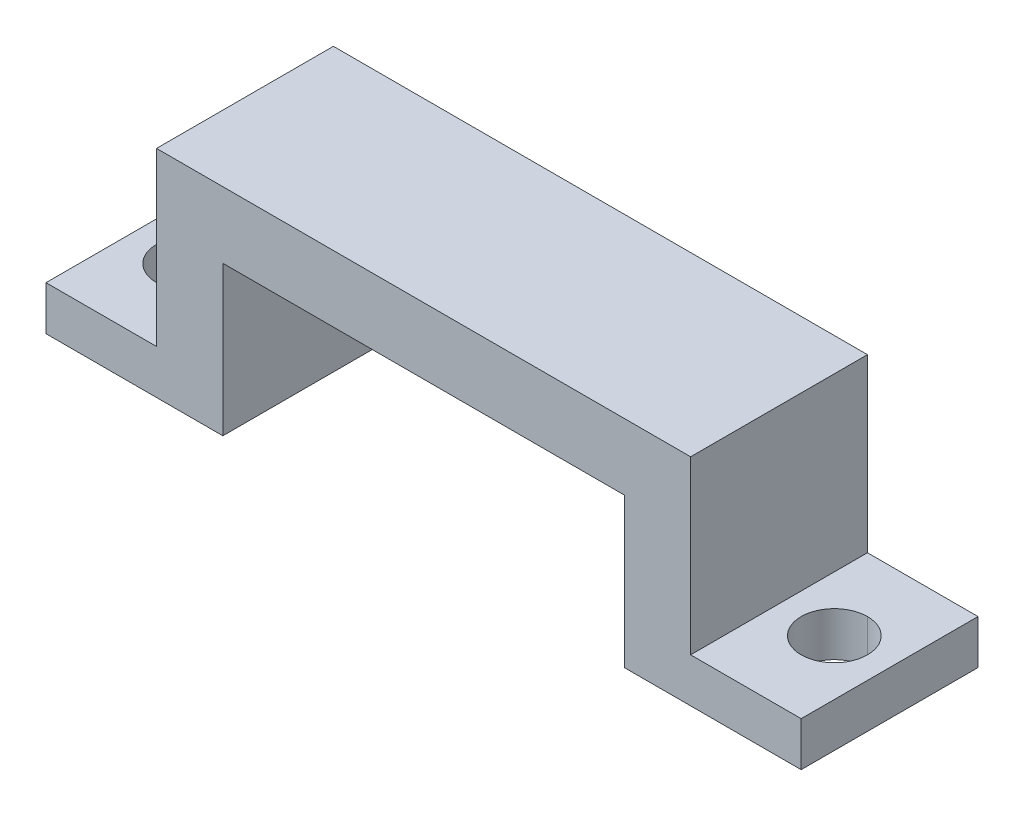
ISO-10303-21;
HEADER;
FILE_DESCRIPTION(('STEP AP214'),'2;1');
FILE_NAME('part.step','',(''),(''),'','','');
FILE_SCHEMA(('AUTOMOTIVE_DESIGN { 1 0 10303 214 1 1 1 1 }'));
ENDSEC;
DATA;
#1=APPLICATION_CONTEXT('core data for automotive mechanical design processes');
#2=APPLICATION_PROTOCOL_DEFINITION('international standard','automotive_design',2000,#1);
#3=PRODUCT_CONTEXT('',#1,'mechanical');
#4=PRODUCT('Part','Part','',(#3));
#5=PRODUCT_RELATED_PRODUCT_CATEGORY('part','',(#4));
#6=PRODUCT_DEFINITION_FORMATION('','',#4);
#7=PRODUCT_DEFINITION_CONTEXT('part definition',#1,'design');
#8=PRODUCT_DEFINITION('design','',#6,#7);
#9=PRODUCT_DEFINITION_SHAPE('','',#8);
#10=(LENGTH_UNIT() NAMED_UNIT(*) SI_UNIT(.MILLI.,.METRE.));
#11=(NAMED_UNIT(*) PLANE_ANGLE_UNIT() SI_UNIT($,.RADIAN.));
#12=(NAMED_UNIT(*) SI_UNIT($,.STERADIAN.) SOLID_ANGLE_UNIT());
#13=UNCERTAINTY_MEASURE_WITH_UNIT(LENGTH_MEASURE(1.E-05),#10,'distance_accuracy_value','');
#14=(GEOMETRIC_REPRESENTATION_CONTEXT(3) GLOBAL_UNCERTAINTY_ASSIGNED_CONTEXT((#13)) GLOBAL_UNIT_ASSIGNED_CONTEXT((#10,
#11,#12)) REPRESENTATION_CONTEXT('',''));
#15=CARTESIAN_POINT('',(0.,0.,0.));
#16=DIRECTION('',(0.,0.,1.));
#17=DIRECTION('',(1.,0.,0.));
#18=AXIS2_PLACEMENT_3D('',#15,#16,#17);
#19=CARTESIAN_POINT('',(14.43,-1.38,4.));
#20=DIRECTION('',(0.,1.,0.));
#21=DIRECTION('',(0.,0.,1.));
#22=AXIS2_PLACEMENT_3D('',#19,#20,#21);
#23=CYLINDRICAL_SURFACE('',#22,1.5);
#24=DIRECTION('',(0.,1.,0.));
#25=VECTOR('',#24,1.);
#26=CARTESIAN_POINT('',(14.43,-1.38,2.5));
#27=LINE('',#26,#25);
#28=CARTESIAN_POINT('',(14.43,-3.38,2.5));
#29=VERTEX_POINT('',#28);
#30=CARTESIAN_POINT('',(14.43,-1.38,2.5));
#31=VERTEX_POINT('',#30);
#32=EDGE_CURVE('E181',#29,#31,#27,.T.);
#33=ORIENTED_EDGE('',*,*,#32,.F.);
#34=CARTESIAN_POINT('',(14.43,-3.38,4.));
#35=DIRECTION('',(0.,1.,0.));
#36=DIRECTION('',(0.,0.,1.));
#37=AXIS2_PLACEMENT_3D('',#34,#35,#36);
#38=CIRCLE('',#37,1.5);
#39=CARTESIAN_POINT('',(14.43,-3.38,5.5));
#40=VERTEX_POINT('',#39);
#41=EDGE_CURVE('E167',#40,#29,#38,.T.);
#42=ORIENTED_EDGE('',*,*,#41,.F.);
#43=DIRECTION('',(0.,1.,0.));
#44=VECTOR('',#43,1.);
#45=CARTESIAN_POINT('',(14.43,-1.38,5.5));
#46=LINE('',#45,#44);
#47=CARTESIAN_POINT('',(14.43,-1.38,5.5));
#48=VERTEX_POINT('',#47);
#49=EDGE_CURVE('E190',#40,#48,#46,.T.);
#50=ORIENTED_EDGE('',*,*,#49,.T.);
#51=CARTESIAN_POINT('',(14.43,-1.38,4.));
#52=DIRECTION('',(0.,1.,0.));
#53=DIRECTION('',(0.,0.,1.));
#54=AXIS2_PLACEMENT_3D('',#51,#52,#53);
#55=CIRCLE('',#54,1.5);
#56=EDGE_CURVE('E182',#48,#31,#55,.T.);
#57=ORIENTED_EDGE('',*,*,#56,.T.);
#58=EDGE_LOOP('',(#33,#42,#50,#57));
#59=FACE_BOUND('',#58,.T.);
#60=ADVANCED_FACE('F16',(#59),#23,.F.);
#61=CARTESIAN_POINT('',(-14.73,-1.38,4.));
#62=DIRECTION('',(0.,1.,0.));
#63=DIRECTION('',(0.,0.,1.));
#64=AXIS2_PLACEMENT_3D('',#61,#62,#63);
#65=CYLINDRICAL_SURFACE('',#64,1.5);
#66=DIRECTION('',(0.,1.,0.));
#67=VECTOR('',#66,1.);
#68=CARTESIAN_POINT('',(-14.73,-1.38,2.5));
#69=LINE('',#68,#67);
#70=CARTESIAN_POINT('',(-14.73,-3.38,2.5));
#71=VERTEX_POINT('',#70);
#72=CARTESIAN_POINT('',(-14.73,-1.38,2.5));
#73=VERTEX_POINT('',#72);
#74=EDGE_CURVE('E197',#71,#73,#69,.T.);
#75=ORIENTED_EDGE('',*,*,#74,.F.);
#76=CARTESIAN_POINT('',(-14.73,-3.38,4.));
#77=DIRECTION('',(0.,1.,0.));
#78=DIRECTION('',(0.,0.,1.));
#79=AXIS2_PLACEMENT_3D('',#76,#77,#78);
#80=CIRCLE('',#79,1.5);
#81=CARTESIAN_POINT('',(-14.73,-3.38,5.5));
#82=VERTEX_POINT('',#81);
#83=EDGE_CURVE('E268',#82,#71,#80,.T.);
#84=ORIENTED_EDGE('',*,*,#83,.F.);
#85=DIRECTION('',(0.,1.,0.));
#86=VECTOR('',#85,1.);
#87=CARTESIAN_POINT('',(-14.73,-1.38,5.5));
#88=LINE('',#87,#86);
#89=CARTESIAN_POINT('',(-14.73,-1.38,5.5));
#90=VERTEX_POINT('',#89);
#91=EDGE_CURVE('E211',#82,#90,#88,.T.);
#92=ORIENTED_EDGE('',*,*,#91,.T.);
#93=CARTESIAN_POINT('',(-14.73,-1.38,4.));
#94=DIRECTION('',(0.,1.,0.));
#95=DIRECTION('',(0.,0.,1.));
#96=AXIS2_PLACEMENT_3D('',#93,#94,#95);
#97=CIRCLE('',#96,1.49999999999999);
#98=EDGE_CURVE('E238',#90,#73,#97,.T.);
#99=ORIENTED_EDGE('',*,*,#98,.T.);
#100=EDGE_LOOP('',(#75,#84,#92,#99));
#101=FACE_BOUND('',#100,.T.);
#102=ADVANCED_FACE('F361',(#101),#65,.F.);
#103=CARTESIAN_POINT('',(0.,0.,0.));
#104=DIRECTION('',(0.,0.,1.));
#105=DIRECTION('',(1.,0.,0.));
#106=AXIS2_PLACEMENT_3D('',#103,#104,#105);
#107=PLANE('',#106);
#108=DIRECTION('',(1.,0.,0.));
#109=VECTOR('',#108,1.);
#110=CARTESIAN_POINT('',(0.,-3.38,0.));
#111=LINE('',#110,#109);
#112=CARTESIAN_POINT('',(8.93,-3.38,0.));
#113=VERTEX_POINT('',#112);
#114=CARTESIAN_POINT('',(16.93,-3.38,0.));
#115=VERTEX_POINT('',#114);
#116=EDGE_CURVE('E247',#113,#115,#111,.T.);
#117=ORIENTED_EDGE('',*,*,#116,.F.);
#118=DIRECTION('',(0.,1.,0.));
#119=VECTOR('',#118,1.);
#120=CARTESIAN_POINT('',(8.93,0.,0.));
#121=LINE('',#120,#119);
#122=CARTESIAN_POINT('',(8.93,3.38,0.));
#123=VERTEX_POINT('',#122);
#124=EDGE_CURVE('E25',#113,#123,#121,.T.);
#125=ORIENTED_EDGE('',*,*,#124,.T.);
#126=DIRECTION('',(1.,0.,0.));
#127=VECTOR('',#126,1.);
#128=CARTESIAN_POINT('',(0.,3.38,0.));
#129=LINE('',#128,#127);
#130=CARTESIAN_POINT('',(-9.23,3.38,0.));
#131=VERTEX_POINT('',#130);
#132=EDGE_CURVE('E338',#131,#123,#129,.T.);
#133=ORIENTED_EDGE('',*,*,#132,.F.);
#134=DIRECTION('',(0.,1.,0.));
#135=VECTOR('',#134,1.);
#136=CARTESIAN_POINT('',(-9.23,0.,0.));
#137=LINE('',#136,#135);
#138=CARTESIAN_POINT('',(-9.23,-3.38,0.));
#139=VERTEX_POINT('',#138);
#140=EDGE_CURVE('E231',#139,#131,#137,.T.);
#141=ORIENTED_EDGE('',*,*,#140,.F.);
#142=DIRECTION('',(-1.,0.,0.));
#143=VECTOR('',#142,1.);
#144=CARTESIAN_POINT('',(0.,-3.38,0.));
#145=LINE('',#144,#143);
#146=CARTESIAN_POINT('',(-17.23,-3.38,0.));
#147=VERTEX_POINT('',#146);
#148=EDGE_CURVE('E241',#139,#147,#145,.T.);
#149=ORIENTED_EDGE('',*,*,#148,.T.);
#150=DIRECTION('',(0.,1.,0.));
#151=VECTOR('',#150,1.);
#152=CARTESIAN_POINT('',(-17.23,0.,0.));
#153=LINE('',#152,#151);
#154=CARTESIAN_POINT('',(-17.23,-1.38,0.));
#155=VERTEX_POINT('',#154);
#156=EDGE_CURVE('E318',#147,#155,#153,.T.);
#157=ORIENTED_EDGE('',*,*,#156,.T.);
#158=DIRECTION('',(-1.,0.,0.));
#159=VECTOR('',#158,1.);
#160=CARTESIAN_POINT('',(0.,-1.38,0.));
#161=LINE('',#160,#159);
#162=CARTESIAN_POINT('',(-12.23,-1.38,0.));
#163=VERTEX_POINT('',#162);
#164=EDGE_CURVE('E206',#163,#155,#161,.T.);
#165=ORIENTED_EDGE('',*,*,#164,.F.);
#166=DIRECTION('',(0.,1.,0.));
#167=VECTOR('',#166,1.);
#168=CARTESIAN_POINT('',(-12.23,0.,0.));
#169=LINE('',#168,#167);
#170=CARTESIAN_POINT('',(-12.23,6.38,0.));
#171=VERTEX_POINT('',#170);
#172=EDGE_CURVE('E325',#163,#171,#169,.T.);
#173=ORIENTED_EDGE('',*,*,#172,.T.);
#174=DIRECTION('',(1.,0.,0.));
#175=VECTOR('',#174,1.);
#176=CARTESIAN_POINT('',(0.,6.38,0.));
#177=LINE('',#176,#175);
#178=CARTESIAN_POINT('',(11.93,6.38,0.));
#179=VERTEX_POINT('',#178);
#180=EDGE_CURVE('E310',#171,#179,#177,.T.);
#181=ORIENTED_EDGE('',*,*,#180,.T.);
#182=DIRECTION('',(0.,1.,0.));
#183=VECTOR('',#182,1.);
#184=CARTESIAN_POINT('',(11.93,0.,0.));
#185=LINE('',#184,#183);
#186=CARTESIAN_POINT('',(11.93,-1.38,0.));
#187=VERTEX_POINT('',#186);
#188=EDGE_CURVE('E277',#187,#179,#185,.T.);
#189=ORIENTED_EDGE('',*,*,#188,.F.);
#190=DIRECTION('',(1.,0.,0.));
#191=VECTOR('',#190,1.);
#192=CARTESIAN_POINT('',(0.,-1.38,0.));
#193=LINE('',#192,#191);
#194=CARTESIAN_POINT('',(16.93,-1.38,0.));
#195=VERTEX_POINT('',#194);
#196=EDGE_CURVE('E291',#187,#195,#193,.T.);
#197=ORIENTED_EDGE('',*,*,#196,.T.);
#198=DIRECTION('',(0.,1.,0.));
#199=VECTOR('',#198,1.);
#200=CARTESIAN_POINT('',(16.93,0.,0.));
#201=LINE('',#200,#199);
#202=EDGE_CURVE('E177',#115,#195,#201,.T.);
#203=ORIENTED_EDGE('',*,*,#202,.F.);
#204=EDGE_LOOP('',(#117,#125,#133,#141,#149,#157,#165,#173,#181,#189,#197,#203));
#205=FACE_BOUND('',#204,.T.);
#206=ADVANCED_FACE('F18',(#205),#107,.F.);
#207=CARTESIAN_POINT('',(0.,0.,8.));
#208=DIRECTION('',(0.,0.,1.));
#209=DIRECTION('',(1.,0.,0.));
#210=AXIS2_PLACEMENT_3D('',#207,#208,#209);
#211=PLANE('',#210);
#212=DIRECTION('',(1.,0.,0.));
#213=VECTOR('',#212,1.);
#214=CARTESIAN_POINT('',(0.,-3.38,8.));
#215=LINE('',#214,#213);
#216=CARTESIAN_POINT('',(8.93,-3.38,8.));
#217=VERTEX_POINT('',#216);
#218=CARTESIAN_POINT('',(16.93,-3.38,8.));
#219=VERTEX_POINT('',#218);
#220=EDGE_CURVE('E246',#217,#219,#215,.T.);
#221=ORIENTED_EDGE('',*,*,#220,.T.);
#222=DIRECTION('',(0.,1.,0.));
#223=VECTOR('',#222,1.);
#224=CARTESIAN_POINT('',(16.93,0.,8.));
#225=LINE('',#224,#223);
#226=CARTESIAN_POINT('',(16.93,-1.38,8.));
#227=VERTEX_POINT('',#226);
#228=EDGE_CURVE('E256',#219,#227,#225,.T.);
#229=ORIENTED_EDGE('',*,*,#228,.T.);
#230=DIRECTION('',(1.,0.,0.));
#231=VECTOR('',#230,1.);
#232=CARTESIAN_POINT('',(0.,-1.38,8.));
#233=LINE('',#232,#231);
#234=CARTESIAN_POINT('',(11.93,-1.38,8.));
#235=VERTEX_POINT('',#234);
#236=EDGE_CURVE('E298',#235,#227,#233,.T.);
#237=ORIENTED_EDGE('',*,*,#236,.F.);
#238=DIRECTION('',(0.,1.,0.));
#239=VECTOR('',#238,1.);
#240=CARTESIAN_POINT('',(11.93,0.,8.));
#241=LINE('',#240,#239);
#242=CARTESIAN_POINT('',(11.93,6.38,8.));
#243=VERTEX_POINT('',#242);
#244=EDGE_CURVE('E306',#235,#243,#241,.T.);
#245=ORIENTED_EDGE('',*,*,#244,.T.);
#246=DIRECTION('',(1.,0.,0.));
#247=VECTOR('',#246,1.);
#248=CARTESIAN_POINT('',(0.,6.38,8.));
#249=LINE('',#248,#247);
#250=CARTESIAN_POINT('',(-12.23,6.38,8.));
#251=VERTEX_POINT('',#250);
#252=EDGE_CURVE('E317',#251,#243,#249,.T.);
#253=ORIENTED_EDGE('',*,*,#252,.F.);
#254=DIRECTION('',(0.,1.,0.));
#255=VECTOR('',#254,1.);
#256=CARTESIAN_POINT('',(-12.23,0.,8.));
#257=LINE('',#256,#255);
#258=CARTESIAN_POINT('',(-12.23,-1.38,8.));
#259=VERTEX_POINT('',#258);
#260=EDGE_CURVE('E322',#259,#251,#257,.T.);
#261=ORIENTED_EDGE('',*,*,#260,.F.);
#262=DIRECTION('',(-1.,0.,0.));
#263=VECTOR('',#262,1.);
#264=CARTESIAN_POINT('',(0.,-1.38,8.));
#265=LINE('',#264,#263);
#266=CARTESIAN_POINT('',(-17.23,-1.38,8.));
#267=VERTEX_POINT('',#266);
#268=EDGE_CURVE('E215',#259,#267,#265,.T.);
#269=ORIENTED_EDGE('',*,*,#268,.T.);
#270=DIRECTION('',(0.,1.,0.));
#271=VECTOR('',#270,1.);
#272=CARTESIAN_POINT('',(-17.23,0.,8.));
#273=LINE('',#272,#271);
#274=CARTESIAN_POINT('',(-17.23,-3.38,8.));
#275=VERTEX_POINT('',#274);
#276=EDGE_CURVE('E321',#275,#267,#273,.T.);
#277=ORIENTED_EDGE('',*,*,#276,.F.);
#278=DIRECTION('',(-1.,0.,0.));
#279=VECTOR('',#278,1.);
#280=CARTESIAN_POINT('',(0.,-3.38,8.));
#281=LINE('',#280,#279);
#282=CARTESIAN_POINT('',(-9.23,-3.38,8.));
#283=VERTEX_POINT('',#282);
#284=EDGE_CURVE('E260',#283,#275,#281,.T.);
#285=ORIENTED_EDGE('',*,*,#284,.F.);
#286=DIRECTION('',(0.,1.,0.));
#287=VECTOR('',#286,1.);
#288=CARTESIAN_POINT('',(-9.23,0.,8.));
#289=LINE('',#288,#287);
#290=CARTESIAN_POINT('',(-9.23,3.38,8.));
#291=VERTEX_POINT('',#290);
#292=EDGE_CURVE('E230',#283,#291,#289,.T.);
#293=ORIENTED_EDGE('',*,*,#292,.T.);
#294=DIRECTION('',(1.,0.,0.));
#295=VECTOR('',#294,1.);
#296=CARTESIAN_POINT('',(0.,3.38,8.));
#297=LINE('',#296,#295);
#298=CARTESIAN_POINT('',(8.93,3.38,8.));
#299=VERTEX_POINT('',#298);
#300=EDGE_CURVE('E345',#291,#299,#297,.T.);
#301=ORIENTED_EDGE('',*,*,#300,.T.);
#302=DIRECTION('',(0.,1.,0.));
#303=VECTOR('',#302,1.);
#304=CARTESIAN_POINT('',(8.93,0.,8.));
#305=LINE('',#304,#303);
#306=EDGE_CURVE('E10',#217,#299,#305,.T.);
#307=ORIENTED_EDGE('',*,*,#306,.F.);
#308=EDGE_LOOP('',(#221,#229,#237,#245,#253,#261,#269,#277,#285,#293,#301,#307));
#309=FACE_BOUND('',#308,.T.);
#310=ADVANCED_FACE('F440',(#309),#211,.T.);
#311=CARTESIAN_POINT('',(8.93,0.,8.));
#312=DIRECTION('',(-1.,0.,0.));
#313=DIRECTION('',(0.,0.,1.));
#314=AXIS2_PLACEMENT_3D('',#311,#312,#313);
#315=PLANE('',#314);
#316=ORIENTED_EDGE('',*,*,#124,.F.);
#317=DIRECTION('',(0.,0.,-1.));
#318=VECTOR('',#317,1.);
#319=CARTESIAN_POINT('',(8.93,-3.38,8.));
#320=LINE('',#319,#318);
#321=EDGE_CURVE('E178',#217,#113,#320,.T.);
#322=ORIENTED_EDGE('',*,*,#321,.F.);
#323=ORIENTED_EDGE('',*,*,#306,.T.);
#324=DIRECTION('',(0.,0.,-1.));
#325=VECTOR('',#324,1.);
#326=CARTESIAN_POINT('',(8.93,3.38,8.));
#327=LINE('',#326,#325);
#328=EDGE_CURVE('E342',#299,#123,#327,.T.);
#329=ORIENTED_EDGE('',*,*,#328,.T.);
#330=EDGE_LOOP('',(#316,#322,#323,#329));
#331=FACE_BOUND('',#330,.T.);
#332=ADVANCED_FACE('F434',(#331),#315,.T.);
#333=CARTESIAN_POINT('',(0.,3.38,8.));
#334=DIRECTION('',(0.,1.,0.));
#335=DIRECTION('',(1.,0.,0.));
#336=AXIS2_PLACEMENT_3D('',#333,#334,#335);
#337=PLANE('',#336);
#338=ORIENTED_EDGE('',*,*,#132,.T.);
#339=ORIENTED_EDGE('',*,*,#328,.F.);
#340=ORIENTED_EDGE('',*,*,#300,.F.);
#341=DIRECTION('',(0.,0.,-1.));
#342=VECTOR('',#341,1.);
#343=CARTESIAN_POINT('',(-9.23,3.38,8.));
#344=LINE('',#343,#342);
#345=EDGE_CURVE('E226',#291,#131,#344,.T.);
#346=ORIENTED_EDGE('',*,*,#345,.T.);
#347=EDGE_LOOP('',(#338,#339,#340,#346));
#348=FACE_BOUND('',#347,.T.);
#349=ADVANCED_FACE('F439',(#348),#337,.F.);
#350=CARTESIAN_POINT('',(-9.23,0.,8.));
#351=DIRECTION('',(-1.,0.,0.));
#352=DIRECTION('',(0.,0.,1.));
#353=AXIS2_PLACEMENT_3D('',#350,#351,#352);
#354=PLANE('',#353);
#355=ORIENTED_EDGE('',*,*,#140,.T.);
#356=ORIENTED_EDGE('',*,*,#345,.F.);
#357=ORIENTED_EDGE('',*,*,#292,.F.);
#358=DIRECTION('',(0.,0.,-1.));
#359=VECTOR('',#358,1.);
#360=CARTESIAN_POINT('',(-9.23,-3.38,8.));
#361=LINE('',#360,#359);
#362=EDGE_CURVE('E251',#283,#139,#361,.T.);
#363=ORIENTED_EDGE('',*,*,#362,.T.);
#364=EDGE_LOOP('',(#355,#356,#357,#363));
#365=FACE_BOUND('',#364,.T.);
#366=ADVANCED_FACE('F460',(#365),#354,.F.);
#367=CARTESIAN_POINT('',(-17.23,0.,8.));
#368=DIRECTION('',(-1.,0.,0.));
#369=DIRECTION('',(0.,0.,1.));
#370=AXIS2_PLACEMENT_3D('',#367,#368,#369);
#371=PLANE('',#370);
#372=ORIENTED_EDGE('',*,*,#156,.F.);
#373=DIRECTION('',(0.,0.,-1.));
#374=VECTOR('',#373,1.);
#375=CARTESIAN_POINT('',(-17.23,-3.38,8.));
#376=LINE('',#375,#374);
#377=EDGE_CURVE('E264',#275,#147,#376,.T.);
#378=ORIENTED_EDGE('',*,*,#377,.F.);
#379=ORIENTED_EDGE('',*,*,#276,.T.);
#380=DIRECTION('',(0.,0.,-1.));
#381=VECTOR('',#380,1.);
#382=CARTESIAN_POINT('',(-17.23,-1.38,8.));
#383=LINE('',#382,#381);
#384=EDGE_CURVE('E210',#267,#155,#383,.T.);
#385=ORIENTED_EDGE('',*,*,#384,.T.);
#386=EDGE_LOOP('',(#372,#378,#379,#385));
#387=FACE_BOUND('',#386,.T.);
#388=ADVANCED_FACE('F405',(#387),#371,.T.);
#389=CARTESIAN_POINT('',(-12.23,0.,8.));
#390=DIRECTION('',(-1.,0.,0.));
#391=DIRECTION('',(0.,1.,0.));
#392=AXIS2_PLACEMENT_3D('',#389,#390,#391);
#393=PLANE('',#392);
#394=ORIENTED_EDGE('',*,*,#172,.F.);
#395=DIRECTION('',(0.,0.,-1.));
#396=VECTOR('',#395,1.);
#397=CARTESIAN_POINT('',(-12.23,-1.38,8.));
#398=LINE('',#397,#396);
#399=EDGE_CURVE('E219',#259,#163,#398,.T.);
#400=ORIENTED_EDGE('',*,*,#399,.F.);
#401=ORIENTED_EDGE('',*,*,#260,.T.);
#402=DIRECTION('',(0.,0.,-1.));
#403=VECTOR('',#402,1.);
#404=CARTESIAN_POINT('',(-12.23,6.38,8.));
#405=LINE('',#404,#403);
#406=EDGE_CURVE('E313',#251,#171,#405,.T.);
#407=ORIENTED_EDGE('',*,*,#406,.T.);
#408=EDGE_LOOP('',(#394,#400,#401,#407));
#409=FACE_BOUND('',#408,.T.);
#410=ADVANCED_FACE('F399',(#409),#393,.T.);
#411=CARTESIAN_POINT('',(0.,6.38,8.));
#412=DIRECTION('',(0.,1.,0.));
#413=DIRECTION('',(1.,0.,0.));
#414=AXIS2_PLACEMENT_3D('',#411,#412,#413);
#415=PLANE('',#414);
#416=ORIENTED_EDGE('',*,*,#180,.F.);
#417=ORIENTED_EDGE('',*,*,#406,.F.);
#418=ORIENTED_EDGE('',*,*,#252,.T.);
#419=DIRECTION('',(0.,0.,-1.));
#420=VECTOR('',#419,1.);
#421=CARTESIAN_POINT('',(11.93,6.38,8.));
#422=LINE('',#421,#420);
#423=EDGE_CURVE('E281',#243,#179,#422,.T.);
#424=ORIENTED_EDGE('',*,*,#423,.T.);
#425=EDGE_LOOP('',(#416,#417,#418,#424));
#426=FACE_BOUND('',#425,.T.);
#427=ADVANCED_FACE('F404',(#426),#415,.T.);
#428=CARTESIAN_POINT('',(11.93,0.,8.));
#429=DIRECTION('',(-1.,0.,0.));
#430=DIRECTION('',(0.,0.,1.));
#431=AXIS2_PLACEMENT_3D('',#428,#429,#430);
#432=PLANE('',#431);
#433=ORIENTED_EDGE('',*,*,#188,.T.);
#434=ORIENTED_EDGE('',*,*,#423,.F.);
#435=ORIENTED_EDGE('',*,*,#244,.F.);
#436=DIRECTION('',(0.,0.,-1.));
#437=VECTOR('',#436,1.);
#438=CARTESIAN_POINT('',(11.93,-1.38,8.));
#439=LINE('',#438,#437);
#440=EDGE_CURVE('E294',#235,#187,#439,.T.);
#441=ORIENTED_EDGE('',*,*,#440,.T.);
#442=EDGE_LOOP('',(#433,#434,#435,#441));
#443=FACE_BOUND('',#442,.T.);
#444=ADVANCED_FACE('F482',(#443),#432,.F.);
#445=CARTESIAN_POINT('',(0.,-1.38,8.));
#446=DIRECTION('',(0.,1.,0.));
#447=DIRECTION('',(1.,0.,0.));
#448=AXIS2_PLACEMENT_3D('',#445,#446,#447);
#449=PLANE('',#448);
#450=ORIENTED_EDGE('',*,*,#56,.F.);
#451=CARTESIAN_POINT('',(14.43,-1.38,4.));
#452=DIRECTION('',(0.,1.,0.));
#453=DIRECTION('',(0.,0.,1.));
#454=AXIS2_PLACEMENT_3D('',#451,#452,#453);
#455=CIRCLE('',#454,1.5);
#456=EDGE_CURVE('E187',#31,#48,#455,.T.);
#457=ORIENTED_EDGE('',*,*,#456,.F.);
#458=EDGE_LOOP('',(#450,#457));
#459=FACE_BOUND('',#458,.T.);
#460=ORIENTED_EDGE('',*,*,#196,.F.);
#461=ORIENTED_EDGE('',*,*,#440,.F.);
#462=ORIENTED_EDGE('',*,*,#236,.T.);
#463=DIRECTION('',(0.,0.,-1.));
#464=VECTOR('',#463,1.);
#465=CARTESIAN_POINT('',(16.93,-1.38,8.));
#466=LINE('',#465,#464);
#467=EDGE_CURVE('E252',#227,#195,#466,.T.);
#468=ORIENTED_EDGE('',*,*,#467,.T.);
#469=EDGE_LOOP('',(#460,#461,#462,#468));
#470=FACE_BOUND('',#469,.T.);
#471=ADVANCED_FACE('F471',(#459,#470),#449,.T.);
#472=CARTESIAN_POINT('',(16.93,0.,8.));
#473=DIRECTION('',(-1.,0.,0.));
#474=DIRECTION('',(0.,0.,1.));
#475=AXIS2_PLACEMENT_3D('',#472,#473,#474);
#476=PLANE('',#475);
#477=ORIENTED_EDGE('',*,*,#202,.T.);
#478=ORIENTED_EDGE('',*,*,#467,.F.);
#479=ORIENTED_EDGE('',*,*,#228,.F.);
#480=DIRECTION('',(0.,0.,-1.));
#481=VECTOR('',#480,1.);
#482=CARTESIAN_POINT('',(16.93,-3.38,8.));
#483=LINE('',#482,#481);
#484=EDGE_CURVE('E242',#219,#115,#483,.T.);
#485=ORIENTED_EDGE('',*,*,#484,.T.);
#486=EDGE_LOOP('',(#477,#478,#479,#485));
#487=FACE_BOUND('',#486,.T.);
#488=ADVANCED_FACE('F380',(#487),#476,.F.);
#489=CARTESIAN_POINT('',(0.,-3.38,8.));
#490=DIRECTION('',(0.,1.,0.));
#491=DIRECTION('',(1.,0.,0.));
#492=AXIS2_PLACEMENT_3D('',#489,#490,#491);
#493=PLANE('',#492);
#494=ORIENTED_EDGE('',*,*,#41,.T.);
#495=CARTESIAN_POINT('',(14.43,-3.38,4.));
#496=DIRECTION('',(0.,1.,0.));
#497=DIRECTION('',(0.,0.,1.));
#498=AXIS2_PLACEMENT_3D('',#495,#496,#497);
#499=CIRCLE('',#498,1.5);
#500=EDGE_CURVE('E172',#29,#40,#499,.T.);
#501=ORIENTED_EDGE('',*,*,#500,.T.);
#502=EDGE_LOOP('',(#494,#501));
#503=FACE_BOUND('',#502,.T.);
#504=ORIENTED_EDGE('',*,*,#116,.T.);
#505=ORIENTED_EDGE('',*,*,#484,.F.);
#506=ORIENTED_EDGE('',*,*,#220,.F.);
#507=ORIENTED_EDGE('',*,*,#321,.T.);
#508=EDGE_LOOP('',(#504,#505,#506,#507));
#509=FACE_BOUND('',#508,.T.);
#510=ADVANCED_FACE('F169',(#503,#509),#493,.F.);
#511=CARTESIAN_POINT('',(0.,-3.38,8.));
#512=DIRECTION('',(0.,-1.,0.));
#513=DIRECTION('',(0.,0.,-1.));
#514=AXIS2_PLACEMENT_3D('',#511,#512,#513);
#515=PLANE('',#514);
#516=ORIENTED_EDGE('',*,*,#83,.T.);
#517=CARTESIAN_POINT('',(-14.73,-3.38,4.));
#518=DIRECTION('',(0.,1.,0.));
#519=DIRECTION('',(0.,0.,1.));
#520=AXIS2_PLACEMENT_3D('',#517,#518,#519);
#521=CIRCLE('',#520,1.5);
#522=EDGE_CURVE('E200',#71,#82,#521,.T.);
#523=ORIENTED_EDGE('',*,*,#522,.T.);
#524=EDGE_LOOP('',(#516,#523));
#525=FACE_BOUND('',#524,.T.);
#526=ORIENTED_EDGE('',*,*,#148,.F.);
#527=ORIENTED_EDGE('',*,*,#362,.F.);
#528=ORIENTED_EDGE('',*,*,#284,.T.);
#529=ORIENTED_EDGE('',*,*,#377,.T.);
#530=EDGE_LOOP('',(#526,#527,#528,#529));
#531=FACE_BOUND('',#530,.T.);
#532=ADVANCED_FACE('F379',(#525,#531),#515,.T.);
#533=CARTESIAN_POINT('',(0.,-1.38,8.));
#534=DIRECTION('',(0.,-1.,0.));
#535=DIRECTION('',(-1.,0.,0.));
#536=AXIS2_PLACEMENT_3D('',#533,#534,#535);
#537=PLANE('',#536);
#538=ORIENTED_EDGE('',*,*,#98,.F.);
#539=CARTESIAN_POINT('',(-14.73,-1.38,4.));
#540=DIRECTION('',(0.,1.,0.));
#541=DIRECTION('',(0.,0.,1.));
#542=AXIS2_PLACEMENT_3D('',#539,#540,#541);
#543=CIRCLE('',#542,1.49999999999999);
#544=EDGE_CURVE('E199',#73,#90,#543,.T.);
#545=ORIENTED_EDGE('',*,*,#544,.F.);
#546=EDGE_LOOP('',(#538,#545));
#547=FACE_BOUND('',#546,.T.);
#548=ORIENTED_EDGE('',*,*,#164,.T.);
#549=ORIENTED_EDGE('',*,*,#384,.F.);
#550=ORIENTED_EDGE('',*,*,#268,.F.);
#551=ORIENTED_EDGE('',*,*,#399,.T.);
#552=EDGE_LOOP('',(#548,#549,#550,#551));
#553=FACE_BOUND('',#552,.T.);
#554=ADVANCED_FACE('F417',(#547,#553),#537,.F.);
#555=CARTESIAN_POINT('',(-14.73,-1.38,4.));
#556=DIRECTION('',(0.,1.,0.));
#557=DIRECTION('',(0.,0.,1.));
#558=AXIS2_PLACEMENT_3D('',#555,#556,#557);
#559=CYLINDRICAL_SURFACE('',#558,1.5);
#560=ORIENTED_EDGE('',*,*,#522,.F.);
#561=ORIENTED_EDGE('',*,*,#74,.T.);
#562=ORIENTED_EDGE('',*,*,#544,.T.);
#563=ORIENTED_EDGE('',*,*,#91,.F.);
#564=EDGE_LOOP('',(#560,#561,#562,#563));
#565=FACE_BOUND('',#564,.T.);
#566=ADVANCED_FACE('F392',(#565),#559,.F.);
#567=CARTESIAN_POINT('',(14.43,-1.38,4.));
#568=DIRECTION('',(0.,1.,0.));
#569=DIRECTION('',(0.,0.,1.));
#570=AXIS2_PLACEMENT_3D('',#567,#568,#569);
#571=CYLINDRICAL_SURFACE('',#570,1.5);
#572=ORIENTED_EDGE('',*,*,#500,.F.);
#573=ORIENTED_EDGE('',*,*,#32,.T.);
#574=ORIENTED_EDGE('',*,*,#456,.T.);
#575=ORIENTED_EDGE('',*,*,#49,.F.);
#576=EDGE_LOOP('',(#572,#573,#574,#575));
#577=FACE_BOUND('',#576,.T.);
#578=ADVANCED_FACE('F189',(#577),#571,.F.);
#579=CLOSED_SHELL('',(#60,#102,#206,#310,#332,#349,#366,#388,#410,#427,#444,#471,#488,#510,#532,
#554,#566,#578));
#580=MANIFOLD_SOLID_BREP('B1',#579);
#581=ADVANCED_BREP_SHAPE_REPRESENTATION('',(#18,#580),#14);
#582=SHAPE_DEFINITION_REPRESENTATION(#9,#581);
ENDSEC;
END-ISO-10303-21;
